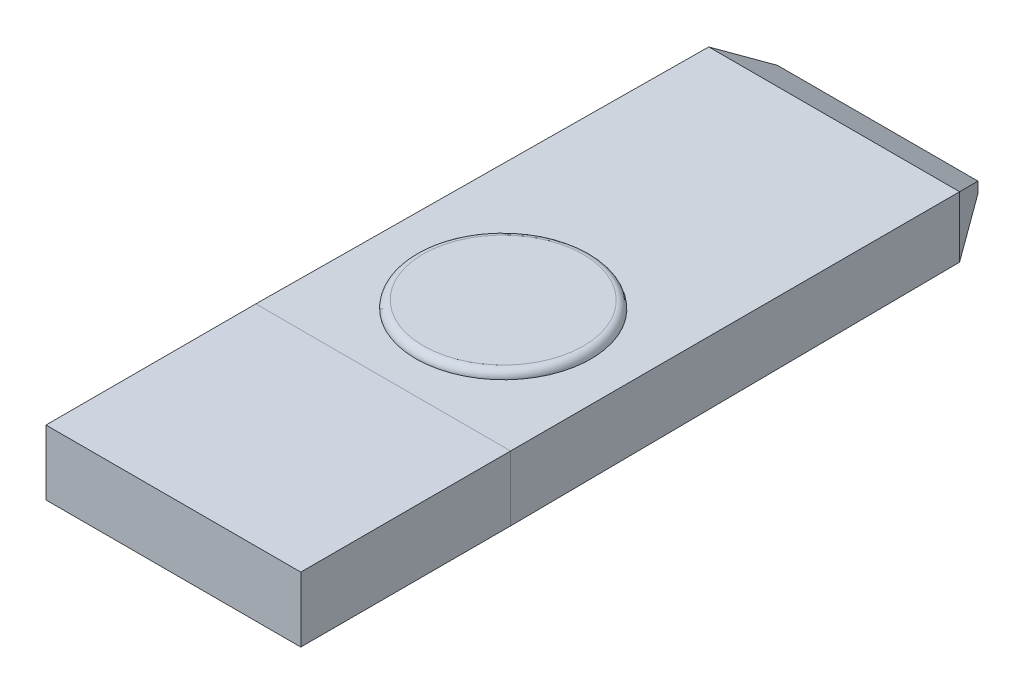
ISO-10303-21;
HEADER;
FILE_DESCRIPTION(('STEP AP214'),'2;1');
FILE_NAME('part.step','',(''),(''),'','','');
FILE_SCHEMA(('AUTOMOTIVE_DESIGN { 1 0 10303 214 1 1 1 1 }'));
ENDSEC;
DATA;
#1=APPLICATION_CONTEXT('core data for automotive mechanical design processes');
#2=APPLICATION_PROTOCOL_DEFINITION('international standard','automotive_design',2000,#1);
#3=PRODUCT_CONTEXT('',#1,'mechanical');
#4=PRODUCT('Part','Part','',(#3));
#5=PRODUCT_RELATED_PRODUCT_CATEGORY('part','',(#4));
#6=PRODUCT_DEFINITION_FORMATION('','',#4);
#7=PRODUCT_DEFINITION_CONTEXT('part definition',#1,'design');
#8=PRODUCT_DEFINITION('design','',#6,#7);
#9=PRODUCT_DEFINITION_SHAPE('','',#8);
#10=(LENGTH_UNIT() NAMED_UNIT(*) SI_UNIT(.MILLI.,.METRE.));
#11=(NAMED_UNIT(*) PLANE_ANGLE_UNIT() SI_UNIT($,.RADIAN.));
#12=(NAMED_UNIT(*) SI_UNIT($,.STERADIAN.) SOLID_ANGLE_UNIT());
#13=UNCERTAINTY_MEASURE_WITH_UNIT(LENGTH_MEASURE(1.E-05),#10,'distance_accuracy_value','');
#14=(GEOMETRIC_REPRESENTATION_CONTEXT(3) GLOBAL_UNCERTAINTY_ASSIGNED_CONTEXT((#13)) GLOBAL_UNIT_ASSIGNED_CONTEXT((#10,
#11,#12)) REPRESENTATION_CONTEXT('',''));
#15=CARTESIAN_POINT('',(0.,0.,0.));
#16=DIRECTION('',(0.,0.,1.));
#17=DIRECTION('',(1.,0.,0.));
#18=AXIS2_PLACEMENT_3D('',#15,#16,#17);
#19=CARTESIAN_POINT('',(0.,39.9999999999999,-9.99999999999999));
#20=DIRECTION('',(0.,-1.,0.));
#21=DIRECTION('',(0.,0.,-1.));
#22=AXIS2_PLACEMENT_3D('',#19,#20,#21);
#23=PLANE('',#22);
#24=DIRECTION('',(1.,0.,0.));
#25=VECTOR('',#24,1.);
#26=CARTESIAN_POINT('',(0.,39.9999999999999,-1.59999999999999));
#27=LINE('',#26,#25);
#28=CARTESIAN_POINT('',(-247.95,39.9999999999999,-1.59999999999999));
#29=VERTEX_POINT('',#28);
#30=CARTESIAN_POINT('',(-237.75,39.9999999999999,-1.59999999999999));
#31=VERTEX_POINT('',#30);
#32=EDGE_CURVE('E146',#29,#31,#27,.T.);
#33=ORIENTED_EDGE('',*,*,#32,.F.);
#34=DIRECTION('',(0.,0.,1.));
#35=VECTOR('',#34,1.);
#36=CARTESIAN_POINT('',(-247.95,39.9999999999999,-9.99999999999999));
#37=LINE('',#36,#35);
#38=CARTESIAN_POINT('',(-247.95,39.9999999999999,-9.99999999999999));
#39=VERTEX_POINT('',#38);
#40=EDGE_CURVE('E132',#39,#29,#37,.T.);
#41=ORIENTED_EDGE('',*,*,#40,.F.);
#42=DIRECTION('',(1.,0.,0.));
#43=VECTOR('',#42,1.);
#44=CARTESIAN_POINT('',(0.,39.9999999999999,-9.99999999999999));
#45=LINE('',#44,#43);
#46=CARTESIAN_POINT('',(-237.75,39.9999999999999,-9.99999999999999));
#47=VERTEX_POINT('',#46);
#48=EDGE_CURVE('E106',#39,#47,#45,.T.);
#49=ORIENTED_EDGE('',*,*,#48,.T.);
#50=DIRECTION('',(0.,0.,1.));
#51=VECTOR('',#50,1.);
#52=CARTESIAN_POINT('',(-237.75,39.9999999999999,-9.99999999999999));
#53=LINE('',#52,#51);
#54=EDGE_CURVE('E122',#47,#31,#53,.T.);
#55=ORIENTED_EDGE('',*,*,#54,.T.);
#56=EDGE_LOOP('',(#33,#41,#49,#55));
#57=FACE_BOUND('',#56,.T.);
#58=ADVANCED_FACE('F35',(#57),#23,.T.);
#59=CARTESIAN_POINT('',(-247.95,3.12500000000002,-9.99999999999999));
#60=DIRECTION('',(-1.,0.,0.));
#61=DIRECTION('',(0.,0.,1.));
#62=AXIS2_PLACEMENT_3D('',#59,#60,#61);
#63=PLANE('',#62);
#64=DIRECTION('',(0.,-1.,0.));
#65=VECTOR('',#64,1.);
#66=CARTESIAN_POINT('',(-247.95,3.12500000000002,-1.59999999999999));
#67=LINE('',#66,#65);
#68=CARTESIAN_POINT('',(-247.95,42.5999999999999,-1.59999999999999));
#69=VERTEX_POINT('',#68);
#70=EDGE_CURVE('E134',#69,#29,#67,.T.);
#71=ORIENTED_EDGE('',*,*,#70,.F.);
#72=DIRECTION('',(0.,0.,1.));
#73=VECTOR('',#72,1.);
#74=CARTESIAN_POINT('',(-247.95,42.5999999999999,-9.99999999999999));
#75=LINE('',#74,#73);
#76=CARTESIAN_POINT('',(-247.95,42.5999999999999,-9.99999999999999));
#77=VERTEX_POINT('',#76);
#78=EDGE_CURVE('E153',#77,#69,#75,.T.);
#79=ORIENTED_EDGE('',*,*,#78,.F.);
#80=DIRECTION('',(0.,-1.,0.));
#81=VECTOR('',#80,1.);
#82=CARTESIAN_POINT('',(-247.95,3.12500000000002,-9.99999999999999));
#83=LINE('',#82,#81);
#84=EDGE_CURVE('E130',#77,#39,#83,.T.);
#85=ORIENTED_EDGE('',*,*,#84,.T.);
#86=ORIENTED_EDGE('',*,*,#40,.T.);
#87=EDGE_LOOP('',(#71,#79,#85,#86));
#88=FACE_BOUND('',#87,.T.);
#89=ADVANCED_FACE('F207',(#88),#63,.T.);
#90=CARTESIAN_POINT('',(0.,42.5999999999999,-9.99999999999999));
#91=DIRECTION('',(0.,1.,0.));
#92=DIRECTION('',(0.,0.,1.));
#93=AXIS2_PLACEMENT_3D('',#90,#91,#92);
#94=PLANE('',#93);
#95=DIRECTION('',(-1.,0.,0.));
#96=VECTOR('',#95,1.);
#97=CARTESIAN_POINT('',(0.,42.5999999999999,-1.59999999999999));
#98=LINE('',#97,#96);
#99=CARTESIAN_POINT('',(-237.75,42.5999999999999,-1.59999999999999));
#100=VERTEX_POINT('',#99);
#101=EDGE_CURVE('E137',#100,#69,#98,.T.);
#102=ORIENTED_EDGE('',*,*,#101,.F.);
#103=DIRECTION('',(0.,0.,1.));
#104=VECTOR('',#103,1.);
#105=CARTESIAN_POINT('',(-237.75,42.5999999999999,-9.99999999999999));
#106=LINE('',#105,#104);
#107=CARTESIAN_POINT('',(-237.75,42.5999999999999,-9.99999999999999));
#108=VERTEX_POINT('',#107);
#109=EDGE_CURVE('E129',#108,#100,#106,.T.);
#110=ORIENTED_EDGE('',*,*,#109,.F.);
#111=DIRECTION('',(-1.,0.,0.));
#112=VECTOR('',#111,1.);
#113=CARTESIAN_POINT('',(0.,42.5999999999999,-9.99999999999999));
#114=LINE('',#113,#112);
#115=EDGE_CURVE('E119',#108,#77,#114,.T.);
#116=ORIENTED_EDGE('',*,*,#115,.T.);
#117=ORIENTED_EDGE('',*,*,#78,.T.);
#118=EDGE_LOOP('',(#102,#110,#116,#117));
#119=FACE_BOUND('',#118,.T.);
#120=ADVANCED_FACE('F212',(#119),#94,.T.);
#121=CARTESIAN_POINT('',(-237.75,3.12500000000002,-9.99999999999999));
#122=DIRECTION('',(1.,0.,0.));
#123=DIRECTION('',(0.,0.,-1.));
#124=AXIS2_PLACEMENT_3D('',#121,#122,#123);
#125=PLANE('',#124);
#126=DIRECTION('',(0.,1.,0.));
#127=VECTOR('',#126,1.);
#128=CARTESIAN_POINT('',(-237.75,3.12500000000002,-1.59999999999999));
#129=LINE('',#128,#127);
#130=EDGE_CURVE('E125',#31,#100,#129,.T.);
#131=ORIENTED_EDGE('',*,*,#130,.F.);
#132=ORIENTED_EDGE('',*,*,#54,.F.);
#133=DIRECTION('',(0.,1.,0.));
#134=VECTOR('',#133,1.);
#135=CARTESIAN_POINT('',(-237.75,3.12500000000002,-9.99999999999999));
#136=LINE('',#135,#134);
#137=EDGE_CURVE('E114',#47,#108,#136,.T.);
#138=ORIENTED_EDGE('',*,*,#137,.T.);
#139=ORIENTED_EDGE('',*,*,#109,.T.);
#140=EDGE_LOOP('',(#131,#132,#138,#139));
#141=FACE_BOUND('',#140,.T.);
#142=ADVANCED_FACE('F123',(#141),#125,.T.);
#143=CARTESIAN_POINT('',(0.,0.,-1.59999999999999));
#144=DIRECTION('',(0.,0.,1.));
#145=DIRECTION('',(0.,-1.,0.));
#146=AXIS2_PLACEMENT_3D('',#143,#144,#145);
#147=PLANE('',#146);
#148=ORIENTED_EDGE('',*,*,#32,.T.);
#149=ORIENTED_EDGE('',*,*,#130,.T.);
#150=ORIENTED_EDGE('',*,*,#101,.T.);
#151=ORIENTED_EDGE('',*,*,#70,.T.);
#152=EDGE_LOOP('',(#148,#149,#150,#151));
#153=FACE_BOUND('',#152,.T.);
#154=ADVANCED_FACE('F243',(#153),#147,.T.);
#155=CARTESIAN_POINT('',(-237.75,0.,-9.99999999999999));
#156=DIRECTION('',(0.999990480720734,0.,-0.00436330928474658));
#157=DIRECTION('',(-0.00436330928474658,0.,-0.999990480720734));
#158=AXIS2_PLACEMENT_3D('',#155,#156,#157);
#159=PLANE('',#158);
#160=DIRECTION('',(0.00436326774997774,-0.00436326774997774,0.999980961713314));
#161=VECTOR('',#160,1.);
#162=CARTESIAN_POINT('',(-237.745473690427,39.9954736904273,-8.96265284213137));
#163=LINE('',#162,#161);
#164=CARTESIAN_POINT('',(-237.828779249498,40.0787792494983,-28.0547594579531));
#165=VERTEX_POINT('',#164);
#166=EDGE_CURVE('E101',#165,#47,#163,.T.);
#167=ORIENTED_EDGE('',*,*,#166,.F.);
#168=DIRECTION('',(0.,1.,0.));
#169=VECTOR('',#168,1.);
#170=CARTESIAN_POINT('',(-237.828779249498,0.,-28.0547594579531));
#171=LINE('',#170,#169);
#172=CARTESIAN_POINT('',(-237.828779249498,42.5212207505015,-28.0547594579531));
#173=VERTEX_POINT('',#172);
#174=EDGE_CURVE('E58',#165,#173,#171,.T.);
#175=ORIENTED_EDGE('',*,*,#174,.T.);
#176=DIRECTION('',(0.00436326774997774,0.00436326774997774,0.999980961713314));
#177=VECTOR('',#176,1.);
#178=CARTESIAN_POINT('',(-237.750811023292,42.5991889767074,-10.1858716674036));
#179=LINE('',#178,#177);
#180=EDGE_CURVE('E110',#173,#108,#179,.T.);
#181=ORIENTED_EDGE('',*,*,#180,.T.);
#182=ORIENTED_EDGE('',*,*,#137,.F.);
#183=EDGE_LOOP('',(#167,#175,#181,#182));
#184=FACE_BOUND('',#183,.T.);
#185=ADVANCED_FACE('F116',(#184),#159,.T.);
#186=CARTESIAN_POINT('',(0.,42.5999999999999,-9.99999999999999));
#187=DIRECTION('',(0.,0.999990480720734,-0.00436330928474658));
#188=DIRECTION('',(0.,0.00436330928474658,0.999990480720734));
#189=AXIS2_PLACEMENT_3D('',#186,#187,#188);
#190=PLANE('',#189);
#191=CARTESIAN_POINT('',(-242.85,42.5790362545533,-14.8045060569382));
#192=DIRECTION('',(0.,0.999990480720735,-0.00436330928474658));
#193=DIRECTION('',(0.,0.00436330928474658,0.999990480720735));
#194=AXIS2_PLACEMENT_3D('',#191,#192,#193);
#195=CIRCLE('',#194,3.49999999999999);
#196=CARTESIAN_POINT('',(-242.85,42.5943078370499,-11.3045393744156));
#197=VERTEX_POINT('',#196);
#198=EDGE_CURVE('E43',#197,#197,#195,.T.);
#199=ORIENTED_EDGE('',*,*,#198,.F.);
#200=EDGE_LOOP('',(#199));
#201=FACE_BOUND('',#200,.T.);
#202=ORIENTED_EDGE('',*,*,#180,.F.);
#203=DIRECTION('',(-1.,0.,0.));
#204=VECTOR('',#203,1.);
#205=CARTESIAN_POINT('',(0.,42.5212207505015,-28.0547594579531));
#206=LINE('',#205,#204);
#207=CARTESIAN_POINT('',(-247.871220750501,42.5212207505015,-28.0547594579531));
#208=VERTEX_POINT('',#207);
#209=EDGE_CURVE('E50',#173,#208,#206,.T.);
#210=ORIENTED_EDGE('',*,*,#209,.T.);
#211=DIRECTION('',(-0.00436326774997774,0.00436326774997774,0.999980961713314));
#212=VECTOR('',#211,1.);
#213=CARTESIAN_POINT('',(-247.945279501751,42.5952795017516,-11.0818516416131));
#214=LINE('',#213,#212);
#215=EDGE_CURVE('E140',#208,#77,#214,.T.);
#216=ORIENTED_EDGE('',*,*,#215,.T.);
#217=ORIENTED_EDGE('',*,*,#115,.F.);
#218=EDGE_LOOP('',(#202,#210,#216,#217));
#219=FACE_BOUND('',#218,.T.);
#220=ADVANCED_FACE('F242',(#201,#219),#190,.T.);
#221=CARTESIAN_POINT('',(-247.95,0.,-9.99999999999999));
#222=DIRECTION('',(-0.999990480720734,0.,-0.00436330928474658));
#223=DIRECTION('',(-0.00436330928474658,0.,0.999990480720734));
#224=AXIS2_PLACEMENT_3D('',#221,#222,#223);
#225=PLANE('',#224);
#226=ORIENTED_EDGE('',*,*,#215,.F.);
#227=DIRECTION('',(0.,-1.,0.));
#228=VECTOR('',#227,1.);
#229=CARTESIAN_POINT('',(-247.871220750501,0.,-28.0547594579531));
#230=LINE('',#229,#228);
#231=CARTESIAN_POINT('',(-247.871220750501,40.0787792494983,-28.0547594579531));
#232=VERTEX_POINT('',#231);
#233=EDGE_CURVE('E168',#208,#232,#230,.T.);
#234=ORIENTED_EDGE('',*,*,#233,.T.);
#235=DIRECTION('',(-0.00436326774997774,-0.00436326774997774,0.999980961713314));
#236=VECTOR('',#235,1.);
#237=CARTESIAN_POINT('',(-247.950761524218,39.9992384757816,-9.82547261276658));
#238=LINE('',#237,#236);
#239=EDGE_CURVE('E148',#232,#39,#238,.T.);
#240=ORIENTED_EDGE('',*,*,#239,.T.);
#241=ORIENTED_EDGE('',*,*,#84,.F.);
#242=EDGE_LOOP('',(#226,#234,#240,#241));
#243=FACE_BOUND('',#242,.T.);
#244=ADVANCED_FACE('F236',(#243),#225,.T.);
#245=CARTESIAN_POINT('',(0.,39.9999999999999,-9.99999999999999));
#246=DIRECTION('',(0.,-0.999990480720734,-0.00436330928474658));
#247=DIRECTION('',(0.,0.00436330928474658,-0.999990480720734));
#248=AXIS2_PLACEMENT_3D('',#245,#246,#247);
#249=PLANE('',#248);
#250=ORIENTED_EDGE('',*,*,#239,.F.);
#251=DIRECTION('',(1.,0.,0.));
#252=VECTOR('',#251,1.);
#253=CARTESIAN_POINT('',(0.,40.0787792494983,-28.0547594579531));
#254=LINE('',#253,#252);
#255=EDGE_CURVE('E109',#232,#165,#254,.T.);
#256=ORIENTED_EDGE('',*,*,#255,.T.);
#257=ORIENTED_EDGE('',*,*,#166,.T.);
#258=ORIENTED_EDGE('',*,*,#48,.F.);
#259=EDGE_LOOP('',(#250,#256,#257,#258));
#260=FACE_BOUND('',#259,.T.);
#261=ADVANCED_FACE('F104',(#260),#249,.T.);
#262=CARTESIAN_POINT('',(-248.45,47.9999999999999,-29.8));
#263=DIRECTION('',(0.,0.,-1.));
#264=DIRECTION('',(0.,-1.,0.));
#265=AXIS2_PLACEMENT_3D('',#262,#263,#264);
#266=PLANE('',#265);
#267=DIRECTION('',(0.,-1.,0.));
#268=VECTOR('',#267,1.);
#269=CARTESIAN_POINT('',(-238.83639434625,47.9999999999999,-29.8));
#270=LINE('',#269,#268);
#271=CARTESIAN_POINT('',(-238.83639434625,41.51360565375,-29.8));
#272=VERTEX_POINT('',#271);
#273=CARTESIAN_POINT('',(-238.83639434625,41.0863943462498,-29.8));
#274=VERTEX_POINT('',#273);
#275=EDGE_CURVE('E161',#272,#274,#270,.T.);
#276=ORIENTED_EDGE('',*,*,#275,.T.);
#277=DIRECTION('',(-1.,0.,0.));
#278=VECTOR('',#277,1.);
#279=CARTESIAN_POINT('',(-248.45,41.0863943462498,-29.8));
#280=LINE('',#279,#278);
#281=CARTESIAN_POINT('',(-246.86360565375,41.0863943462498,-29.8));
#282=VERTEX_POINT('',#281);
#283=EDGE_CURVE('E163',#274,#282,#280,.T.);
#284=ORIENTED_EDGE('',*,*,#283,.T.);
#285=DIRECTION('',(0.,1.,0.));
#286=VECTOR('',#285,1.);
#287=CARTESIAN_POINT('',(-246.86360565375,47.9999999999999,-29.8));
#288=LINE('',#287,#286);
#289=CARTESIAN_POINT('',(-246.86360565375,41.51360565375,-29.8));
#290=VERTEX_POINT('',#289);
#291=EDGE_CURVE('E157',#282,#290,#288,.T.);
#292=ORIENTED_EDGE('',*,*,#291,.T.);
#293=DIRECTION('',(1.,0.,0.));
#294=VECTOR('',#293,1.);
#295=CARTESIAN_POINT('',(-248.45,41.51360565375,-29.8));
#296=LINE('',#295,#294);
#297=EDGE_CURVE('E159',#290,#272,#296,.T.);
#298=ORIENTED_EDGE('',*,*,#297,.T.);
#299=EDGE_LOOP('',(#276,#284,#292,#298));
#300=FACE_BOUND('',#299,.T.);
#301=ADVANCED_FACE('F189',(#300),#266,.T.);
#302=CARTESIAN_POINT('',(0.,42.5212207505015,-28.0547594579531));
#303=DIRECTION('',(0.,-0.866025403784435,0.500000000000007));
#304=DIRECTION('',(-1.,0.,0.));
#305=AXIS2_PLACEMENT_3D('',#302,#303,#304);
#306=PLANE('',#305);
#307=DIRECTION('',(-0.447213595499963,-0.447213595499963,-0.774596669241478));
#308=VECTOR('',#307,1.);
#309=CARTESIAN_POINT('',(-190.263023399597,90.0869766004021,54.33154637449));
#310=LINE('',#309,#308);
#311=EDGE_CURVE('E174',#272,#173,#310,.F.);
#312=ORIENTED_EDGE('',*,*,#311,.F.);
#313=ORIENTED_EDGE('',*,*,#297,.F.);
#314=DIRECTION('',(0.447213595499963,-0.447213595499963,-0.774596669241478));
#315=VECTOR('',#314,1.);
#316=CARTESIAN_POINT('',(-239.366976600401,34.016976600401,-42.7845424058972));
#317=LINE('',#316,#315);
#318=EDGE_CURVE('E111',#208,#290,#317,.T.);
#319=ORIENTED_EDGE('',*,*,#318,.F.);
#320=ORIENTED_EDGE('',*,*,#209,.F.);
#321=EDGE_LOOP('',(#312,#313,#319,#320));
#322=FACE_BOUND('',#321,.T.);
#323=ADVANCED_FACE('F186',(#322),#306,.F.);
#324=CARTESIAN_POINT('',(-247.871220750501,0.,-28.0547594579531));
#325=DIRECTION('',(0.866025403784435,0.,0.500000000000007));
#326=DIRECTION('',(0.,-1.,0.));
#327=AXIS2_PLACEMENT_3D('',#324,#325,#326);
#328=PLANE('',#327);
#329=ORIENTED_EDGE('',*,*,#318,.T.);
#330=ORIENTED_EDGE('',*,*,#291,.F.);
#331=DIRECTION('',(-0.447213595499963,-0.447213595499963,0.774596669241478));
#332=VECTOR('',#331,1.);
#333=CARTESIAN_POINT('',(-255.886976600401,32.0630233995985,-14.1710630648594));
#334=LINE('',#333,#332);
#335=EDGE_CURVE('E172',#232,#282,#334,.F.);
#336=ORIENTED_EDGE('',*,*,#335,.F.);
#337=ORIENTED_EDGE('',*,*,#233,.F.);
#338=EDGE_LOOP('',(#329,#330,#336,#337));
#339=FACE_BOUND('',#338,.T.);
#340=ADVANCED_FACE('F181',(#339),#328,.F.);
#341=CARTESIAN_POINT('',(-237.828779249498,0.,-28.0547594579531));
#342=DIRECTION('',(-0.866025403784435,0.,0.500000000000007));
#343=DIRECTION('',(0.,1.,0.));
#344=AXIS2_PLACEMENT_3D('',#341,#342,#343);
#345=PLANE('',#344);
#346=ORIENTED_EDGE('',*,*,#311,.T.);
#347=ORIENTED_EDGE('',*,*,#174,.F.);
#348=DIRECTION('',(-0.447213595499963,0.447213595499963,-0.774596669241478));
#349=VECTOR('',#348,1.);
#350=CARTESIAN_POINT('',(-229.813023399598,32.0630233995985,-14.1710630648594));
#351=LINE('',#350,#349);
#352=EDGE_CURVE('E170',#274,#165,#351,.F.);
#353=ORIENTED_EDGE('',*,*,#352,.F.);
#354=ORIENTED_EDGE('',*,*,#275,.F.);
#355=EDGE_LOOP('',(#346,#347,#353,#354));
#356=FACE_BOUND('',#355,.T.);
#357=ADVANCED_FACE('F195',(#356),#345,.F.);
#358=CARTESIAN_POINT('',(0.,40.0787792494983,-28.0547594579531));
#359=DIRECTION('',(0.,0.866025403784435,0.500000000000007));
#360=DIRECTION('',(1.,0.,0.));
#361=AXIS2_PLACEMENT_3D('',#358,#359,#360);
#362=PLANE('',#361);
#363=ORIENTED_EDGE('',*,*,#335,.T.);
#364=ORIENTED_EDGE('',*,*,#283,.F.);
#365=ORIENTED_EDGE('',*,*,#352,.T.);
#366=ORIENTED_EDGE('',*,*,#255,.F.);
#367=EDGE_LOOP('',(#363,#364,#365,#366));
#368=FACE_BOUND('',#367,.T.);
#369=ADVANCED_FACE('F193',(#368),#362,.F.);
#370=CARTESIAN_POINT('',(-242.85,42.8790333987695,-14.8058150497236));
#371=DIRECTION('',(0.,0.999990480720735,-0.00436330928474658));
#372=DIRECTION('',(0.,0.00436330928474658,0.999990480720735));
#373=AXIS2_PLACEMENT_3D('',#370,#371,#372);
#374=PLANE('',#373);
#375=CARTESIAN_POINT('',(-242.85,42.8790333987695,-14.8058150497236));
#376=DIRECTION('',(0.,0.999990480720735,-0.00436330928474658));
#377=DIRECTION('',(0.,0.00436330928474658,0.999990480720735));
#378=AXIS2_PLACEMENT_3D('',#375,#376,#377);
#379=CIRCLE('',#378,3.19999999999999);
#380=CARTESIAN_POINT('',(-242.85,42.8929959884807,-11.6058455114172));
#381=VERTEX_POINT('',#380);
#382=EDGE_CURVE('E11',#381,#381,#379,.T.);
#383=ORIENTED_EDGE('',*,*,#382,.T.);
#384=EDGE_LOOP('',(#383));
#385=FACE_BOUND('',#384,.T.);
#386=ADVANCED_FACE('F202',(#385),#374,.T.);
#387=CARTESIAN_POINT('',(-242.85,42.5790362545533,-14.8045060569382));
#388=DIRECTION('',(0.,0.999990480720735,-0.00436330928474658));
#389=DIRECTION('',(0.,0.00436330928474658,0.999990480720735));
#390=AXIS2_PLACEMENT_3D('',#387,#388,#389);
#391=TOROIDAL_SURFACE('',#390,3.19999999999999,0.3);
#392=ORIENTED_EDGE('',*,*,#198,.T.);
#393=EDGE_LOOP('',(#392));
#394=FACE_BOUND('',#393,.T.);
#395=ORIENTED_EDGE('',*,*,#382,.F.);
#396=EDGE_LOOP('',(#395));
#397=FACE_BOUND('',#396,.T.);
#398=ADVANCED_FACE('F37',(#394,#397),#391,.T.);
#399=CLOSED_SHELL('',(#58,#89,#120,#142,#154,#185,#220,#244,#261,#301,#323,#340,#357,#369,#386,#398));
#400=MANIFOLD_SOLID_BREP('B2',#399);
#401=ADVANCED_BREP_SHAPE_REPRESENTATION('',(#18,#400),#14);
#402=SHAPE_DEFINITION_REPRESENTATION(#9,#401);
ENDSEC;
END-ISO-10303-21;
